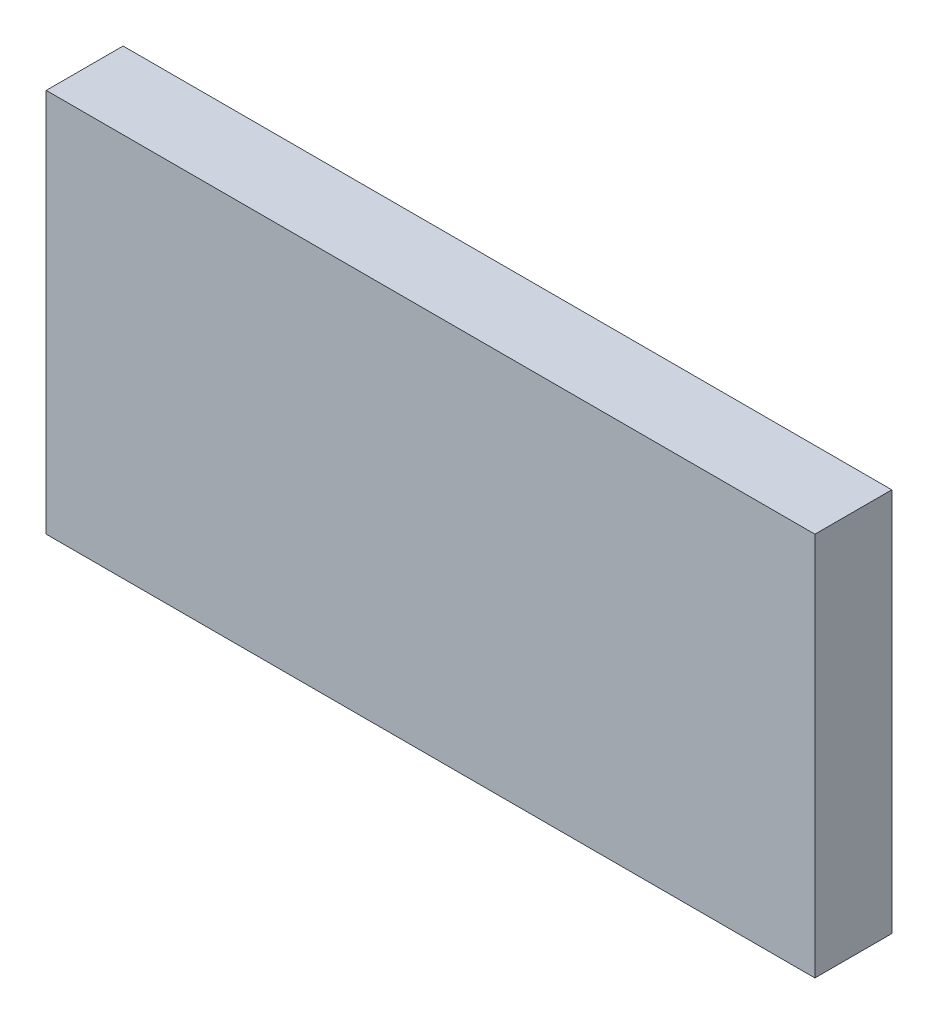
ISO-10303-21;
HEADER;
FILE_DESCRIPTION(('STEP AP214'),'2;1');
FILE_NAME('part.step','',(''),(''),'','','');
FILE_SCHEMA(('AUTOMOTIVE_DESIGN { 1 0 10303 214 1 1 1 1 }'));
ENDSEC;
DATA;
#1=APPLICATION_CONTEXT('core data for automotive mechanical design processes');
#2=APPLICATION_PROTOCOL_DEFINITION('international standard','automotive_design',2000,#1);
#3=PRODUCT_CONTEXT('',#1,'mechanical');
#4=PRODUCT('Part','Part','',(#3));
#5=PRODUCT_RELATED_PRODUCT_CATEGORY('part','',(#4));
#6=PRODUCT_DEFINITION_FORMATION('','',#4);
#7=PRODUCT_DEFINITION_CONTEXT('part definition',#1,'design');
#8=PRODUCT_DEFINITION('design','',#6,#7);
#9=PRODUCT_DEFINITION_SHAPE('','',#8);
#10=(LENGTH_UNIT() NAMED_UNIT(*) SI_UNIT(.MILLI.,.METRE.));
#11=(NAMED_UNIT(*) PLANE_ANGLE_UNIT() SI_UNIT($,.RADIAN.));
#12=(NAMED_UNIT(*) SI_UNIT($,.STERADIAN.) SOLID_ANGLE_UNIT());
#13=UNCERTAINTY_MEASURE_WITH_UNIT(LENGTH_MEASURE(1.E-05),#10,'distance_accuracy_value','');
#14=(GEOMETRIC_REPRESENTATION_CONTEXT(3) GLOBAL_UNCERTAINTY_ASSIGNED_CONTEXT((#13)) GLOBAL_UNIT_ASSIGNED_CONTEXT((#10,
#11,#12)) REPRESENTATION_CONTEXT('',''));
#15=CARTESIAN_POINT('',(0.,0.,0.));
#16=DIRECTION('',(0.,0.,1.));
#17=DIRECTION('',(1.,0.,0.));
#18=AXIS2_PLACEMENT_3D('',#15,#16,#17);
#19=CARTESIAN_POINT('',(0.,0.,2.54));
#20=DIRECTION('',(-1.,0.,0.));
#21=DIRECTION('',(0.,-1.,0.));
#22=AXIS2_PLACEMENT_3D('',#19,#20,#21);
#23=PLANE('',#22);
#24=DIRECTION('',(0.,1.,0.));
#25=VECTOR('',#24,1.);
#26=CARTESIAN_POINT('',(0.,0.,0.));
#27=LINE('',#26,#25);
#28=CARTESIAN_POINT('',(0.,0.,0.));
#29=VERTEX_POINT('',#28);
#30=CARTESIAN_POINT('',(0.,12.7,0.));
#31=VERTEX_POINT('',#30);
#32=EDGE_CURVE('E107',#29,#31,#27,.T.);
#33=ORIENTED_EDGE('',*,*,#32,.T.);
#34=DIRECTION('',(0.,0.,-1.));
#35=VECTOR('',#34,1.);
#36=CARTESIAN_POINT('',(0.,12.7,2.54));
#37=LINE('',#36,#35);
#38=CARTESIAN_POINT('',(0.,12.7,2.54));
#39=VERTEX_POINT('',#38);
#40=EDGE_CURVE('E11',#39,#31,#37,.T.);
#41=ORIENTED_EDGE('',*,*,#40,.F.);
#42=DIRECTION('',(0.,1.,0.));
#43=VECTOR('',#42,1.);
#44=CARTESIAN_POINT('',(0.,0.,2.54));
#45=LINE('',#44,#43);
#46=CARTESIAN_POINT('',(0.,0.,2.54));
#47=VERTEX_POINT('',#46);
#48=EDGE_CURVE('E89',#47,#39,#45,.T.);
#49=ORIENTED_EDGE('',*,*,#48,.F.);
#50=DIRECTION('',(0.,0.,-1.));
#51=VECTOR('',#50,1.);
#52=CARTESIAN_POINT('',(0.,0.,2.54));
#53=LINE('',#52,#51);
#54=EDGE_CURVE('E56',#47,#29,#53,.T.);
#55=ORIENTED_EDGE('',*,*,#54,.T.);
#56=EDGE_LOOP('',(#33,#41,#49,#55));
#57=FACE_BOUND('',#56,.T.);
#58=ADVANCED_FACE('F39',(#57),#23,.F.);
#59=CARTESIAN_POINT('',(0.,12.7,2.54));
#60=DIRECTION('',(0.,-1.,0.));
#61=DIRECTION('',(1.,0.,0.));
#62=AXIS2_PLACEMENT_3D('',#59,#60,#61);
#63=PLANE('',#62);
#64=DIRECTION('',(-1.,0.,0.));
#65=VECTOR('',#64,1.);
#66=CARTESIAN_POINT('',(0.,12.7,0.));
#67=LINE('',#66,#65);
#68=CARTESIAN_POINT('',(-25.4,12.7,0.));
#69=VERTEX_POINT('',#68);
#70=EDGE_CURVE('E95',#31,#69,#67,.T.);
#71=ORIENTED_EDGE('',*,*,#70,.T.);
#72=DIRECTION('',(0.,0.,-1.));
#73=VECTOR('',#72,1.);
#74=CARTESIAN_POINT('',(-25.4,12.7,2.54));
#75=LINE('',#74,#73);
#76=CARTESIAN_POINT('',(-25.4,12.7,2.54));
#77=VERTEX_POINT('',#76);
#78=EDGE_CURVE('E48',#77,#69,#75,.T.);
#79=ORIENTED_EDGE('',*,*,#78,.F.);
#80=DIRECTION('',(-1.,0.,0.));
#81=VECTOR('',#80,1.);
#82=CARTESIAN_POINT('',(0.,12.7,2.54));
#83=LINE('',#82,#81);
#84=EDGE_CURVE('E81',#39,#77,#83,.T.);
#85=ORIENTED_EDGE('',*,*,#84,.F.);
#86=ORIENTED_EDGE('',*,*,#40,.T.);
#87=EDGE_LOOP('',(#71,#79,#85,#86));
#88=FACE_BOUND('',#87,.T.);
#89=ADVANCED_FACE('F94',(#88),#63,.F.);
#90=CARTESIAN_POINT('',(-25.4,0.,2.54));
#91=DIRECTION('',(-1.,0.,0.));
#92=DIRECTION('',(0.,0.,1.));
#93=AXIS2_PLACEMENT_3D('',#90,#91,#92);
#94=PLANE('',#93);
#95=DIRECTION('',(0.,1.,0.));
#96=VECTOR('',#95,1.);
#97=CARTESIAN_POINT('',(-25.4,0.,0.));
#98=LINE('',#97,#96);
#99=CARTESIAN_POINT('',(-25.4,0.,0.));
#100=VERTEX_POINT('',#99);
#101=EDGE_CURVE('E112',#100,#69,#98,.T.);
#102=ORIENTED_EDGE('',*,*,#101,.F.);
#103=DIRECTION('',(0.,0.,-1.));
#104=VECTOR('',#103,1.);
#105=CARTESIAN_POINT('',(-25.4,0.,2.54));
#106=LINE('',#105,#104);
#107=CARTESIAN_POINT('',(-25.4,0.,2.54));
#108=VERTEX_POINT('',#107);
#109=EDGE_CURVE('E70',#108,#100,#106,.T.);
#110=ORIENTED_EDGE('',*,*,#109,.F.);
#111=DIRECTION('',(0.,1.,0.));
#112=VECTOR('',#111,1.);
#113=CARTESIAN_POINT('',(-25.4,0.,2.54));
#114=LINE('',#113,#112);
#115=EDGE_CURVE('E88',#108,#77,#114,.T.);
#116=ORIENTED_EDGE('',*,*,#115,.T.);
#117=ORIENTED_EDGE('',*,*,#78,.T.);
#118=EDGE_LOOP('',(#102,#110,#116,#117));
#119=FACE_BOUND('',#118,.T.);
#120=ADVANCED_FACE('F99',(#119),#94,.T.);
#121=CARTESIAN_POINT('',(0.,0.,2.54));
#122=DIRECTION('',(0.,-1.,0.));
#123=DIRECTION('',(1.,0.,0.));
#124=AXIS2_PLACEMENT_3D('',#121,#122,#123);
#125=PLANE('',#124);
#126=DIRECTION('',(-1.,0.,0.));
#127=VECTOR('',#126,1.);
#128=CARTESIAN_POINT('',(0.,0.,0.));
#129=LINE('',#128,#127);
#130=EDGE_CURVE('E115',#29,#100,#129,.T.);
#131=ORIENTED_EDGE('',*,*,#130,.F.);
#132=ORIENTED_EDGE('',*,*,#54,.F.);
#133=DIRECTION('',(-1.,0.,0.));
#134=VECTOR('',#133,1.);
#135=CARTESIAN_POINT('',(0.,0.,2.54));
#136=LINE('',#135,#134);
#137=EDGE_CURVE('E101',#47,#108,#136,.T.);
#138=ORIENTED_EDGE('',*,*,#137,.T.);
#139=ORIENTED_EDGE('',*,*,#109,.T.);
#140=EDGE_LOOP('',(#131,#132,#138,#139));
#141=FACE_BOUND('',#140,.T.);
#142=ADVANCED_FACE('F125',(#141),#125,.T.);
#143=CARTESIAN_POINT('',(0.,0.,2.54));
#144=DIRECTION('',(0.,0.,1.));
#145=DIRECTION('',(1.,0.,0.));
#146=AXIS2_PLACEMENT_3D('',#143,#144,#145);
#147=PLANE('',#146);
#148=ORIENTED_EDGE('',*,*,#48,.T.);
#149=ORIENTED_EDGE('',*,*,#84,.T.);
#150=ORIENTED_EDGE('',*,*,#115,.F.);
#151=ORIENTED_EDGE('',*,*,#137,.F.);
#152=EDGE_LOOP('',(#148,#149,#150,#151));
#153=FACE_BOUND('',#152,.T.);
#154=ADVANCED_FACE('F85',(#153),#147,.T.);
#155=CARTESIAN_POINT('',(0.,0.,0.));
#156=DIRECTION('',(0.,0.,1.));
#157=DIRECTION('',(1.,0.,0.));
#158=AXIS2_PLACEMENT_3D('',#155,#156,#157);
#159=PLANE('',#158);
#160=ORIENTED_EDGE('',*,*,#32,.F.);
#161=ORIENTED_EDGE('',*,*,#130,.T.);
#162=ORIENTED_EDGE('',*,*,#101,.T.);
#163=ORIENTED_EDGE('',*,*,#70,.F.);
#164=EDGE_LOOP('',(#160,#161,#162,#163));
#165=FACE_BOUND('',#164,.T.);
#166=ADVANCED_FACE('F124',(#165),#159,.F.);
#167=CLOSED_SHELL('',(#58,#89,#120,#142,#154,#166));
#168=MANIFOLD_SOLID_BREP('B2',#167);
#169=ADVANCED_BREP_SHAPE_REPRESENTATION('',(#18,#168),#14);
#170=SHAPE_DEFINITION_REPRESENTATION(#9,#169);
ENDSEC;
END-ISO-10303-21;
